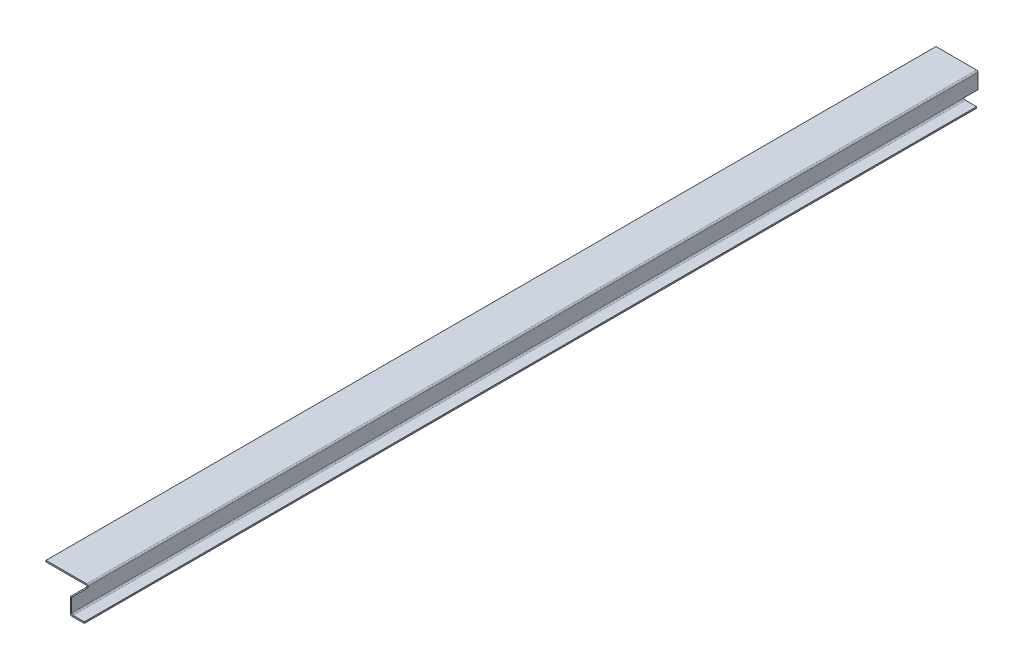
ISO-10303-21;
HEADER;
FILE_DESCRIPTION(('STEP AP214'),'2;1');
FILE_NAME('part.step','',(''),(''),'','','');
FILE_SCHEMA(('AUTOMOTIVE_DESIGN { 1 0 10303 214 1 1 1 1 }'));
ENDSEC;
DATA;
#1=APPLICATION_CONTEXT('core data for automotive mechanical design processes');
#2=APPLICATION_PROTOCOL_DEFINITION('international standard','automotive_design',2000,#1);
#3=PRODUCT_CONTEXT('',#1,'mechanical');
#4=PRODUCT('Part','Part','',(#3));
#5=PRODUCT_RELATED_PRODUCT_CATEGORY('part','',(#4));
#6=PRODUCT_DEFINITION_FORMATION('','',#4);
#7=PRODUCT_DEFINITION_CONTEXT('part definition',#1,'design');
#8=PRODUCT_DEFINITION('design','',#6,#7);
#9=PRODUCT_DEFINITION_SHAPE('','',#8);
#10=(LENGTH_UNIT() NAMED_UNIT(*) SI_UNIT(.MILLI.,.METRE.));
#11=(NAMED_UNIT(*) PLANE_ANGLE_UNIT() SI_UNIT($,.RADIAN.));
#12=(NAMED_UNIT(*) SI_UNIT($,.STERADIAN.) SOLID_ANGLE_UNIT());
#13=UNCERTAINTY_MEASURE_WITH_UNIT(LENGTH_MEASURE(1.E-05),#10,'distance_accuracy_value','');
#14=(GEOMETRIC_REPRESENTATION_CONTEXT(3) GLOBAL_UNCERTAINTY_ASSIGNED_CONTEXT((#13)) GLOBAL_UNIT_ASSIGNED_CONTEXT((#10,
#11,#12)) REPRESENTATION_CONTEXT('',''));
#15=CARTESIAN_POINT('',(0.,0.,0.));
#16=DIRECTION('',(0.,0.,1.));
#17=DIRECTION('',(1.,0.,0.));
#18=AXIS2_PLACEMENT_3D('',#15,#16,#17);
#19=CARTESIAN_POINT('',(0.,0.,0.));
#20=DIRECTION('',(0.,0.,1.));
#21=DIRECTION('',(1.,0.,0.));
#22=AXIS2_PLACEMENT_3D('',#19,#20,#21);
#23=PLANE('',#22);
#24=DIRECTION('',(1.,0.,0.));
#25=VECTOR('',#24,1.);
#26=CARTESIAN_POINT('',(87.,-32.,0.));
#27=LINE('',#26,#25);
#28=CARTESIAN_POINT('',(87.,-32.,0.));
#29=VERTEX_POINT('',#28);
#30=CARTESIAN_POINT('',(90.,-32.,0.));
#31=VERTEX_POINT('',#30);
#32=EDGE_CURVE('E146',#29,#31,#27,.T.);
#33=ORIENTED_EDGE('',*,*,#32,.F.);
#34=DIRECTION('',(0.,-1.,0.));
#35=VECTOR('',#34,1.);
#36=CARTESIAN_POINT('',(87.,0.,0.));
#37=LINE('',#36,#35);
#38=CARTESIAN_POINT('',(87.,-3.,0.));
#39=VERTEX_POINT('',#38);
#40=EDGE_CURVE('E159',#39,#29,#37,.T.);
#41=ORIENTED_EDGE('',*,*,#40,.F.);
#42=CARTESIAN_POINT('',(84.,-3.,0.));
#43=DIRECTION('',(0.,0.,1.));
#44=DIRECTION('',(1.,0.,0.));
#45=AXIS2_PLACEMENT_3D('',#42,#43,#44);
#46=CIRCLE('',#45,3.);
#47=CARTESIAN_POINT('',(84.,0.,0.));
#48=VERTEX_POINT('',#47);
#49=EDGE_CURVE('E216',#39,#48,#46,.T.);
#50=ORIENTED_EDGE('',*,*,#49,.T.);
#51=DIRECTION('',(1.,0.,0.));
#52=VECTOR('',#51,1.);
#53=CARTESIAN_POINT('',(0.,0.,0.));
#54=LINE('',#53,#52);
#55=CARTESIAN_POINT('',(0.,0.,0.));
#56=VERTEX_POINT('',#55);
#57=EDGE_CURVE('E168',#56,#48,#54,.T.);
#58=ORIENTED_EDGE('',*,*,#57,.F.);
#59=DIRECTION('',(0.,-1.,0.));
#60=VECTOR('',#59,1.);
#61=CARTESIAN_POINT('',(0.,3.,0.));
#62=LINE('',#61,#60);
#63=CARTESIAN_POINT('',(0.,3.,0.));
#64=VERTEX_POINT('',#63);
#65=EDGE_CURVE('E173',#64,#56,#62,.T.);
#66=ORIENTED_EDGE('',*,*,#65,.F.);
#67=DIRECTION('',(-1.,0.,0.));
#68=VECTOR('',#67,1.);
#69=CARTESIAN_POINT('',(0.,3.,0.));
#70=LINE('',#69,#68);
#71=CARTESIAN_POINT('',(87.,3.,0.));
#72=VERTEX_POINT('',#71);
#73=EDGE_CURVE('E170',#72,#64,#70,.T.);
#74=ORIENTED_EDGE('',*,*,#73,.F.);
#75=CARTESIAN_POINT('',(87.,0.,0.));
#76=DIRECTION('',(0.,0.,1.));
#77=DIRECTION('',(1.,0.,0.));
#78=AXIS2_PLACEMENT_3D('',#75,#76,#77);
#79=CIRCLE('',#78,3.);
#80=CARTESIAN_POINT('',(90.,0.,0.));
#81=VERTEX_POINT('',#80);
#82=EDGE_CURVE('E194',#72,#81,#79,.F.);
#83=ORIENTED_EDGE('',*,*,#82,.T.);
#84=DIRECTION('',(0.,1.,0.));
#85=VECTOR('',#84,1.);
#86=CARTESIAN_POINT('',(90.,3.,0.));
#87=LINE('',#86,#85);
#88=EDGE_CURVE('E161',#31,#81,#87,.T.);
#89=ORIENTED_EDGE('',*,*,#88,.F.);
#90=EDGE_LOOP('',(#33,#41,#50,#58,#66,#74,#83,#89));
#91=FACE_BOUND('',#90,.T.);
#92=ADVANCED_FACE('F35',(#91),#23,.F.);
#93=CARTESIAN_POINT('',(0.,3.,1940.));
#94=DIRECTION('',(1.,0.,0.));
#95=DIRECTION('',(0.,0.,-1.));
#96=AXIS2_PLACEMENT_3D('',#93,#94,#95);
#97=PLANE('',#96);
#98=DIRECTION('',(0.,0.,-1.));
#99=VECTOR('',#98,1.);
#100=CARTESIAN_POINT('',(0.,0.,1940.));
#101=LINE('',#100,#99);
#102=CARTESIAN_POINT('',(0.,0.,1905.));
#103=VERTEX_POINT('',#102);
#104=EDGE_CURVE('E189',#103,#56,#101,.T.);
#105=ORIENTED_EDGE('',*,*,#104,.F.);
#106=DIRECTION('',(0.,1.,0.));
#107=VECTOR('',#106,1.);
#108=CARTESIAN_POINT('',(0.,-3.,1905.));
#109=LINE('',#108,#107);
#110=CARTESIAN_POINT('',(0.,3.,1905.));
#111=VERTEX_POINT('',#110);
#112=EDGE_CURVE('E254',#103,#111,#109,.T.);
#113=ORIENTED_EDGE('',*,*,#112,.T.);
#114=DIRECTION('',(0.,0.,-1.));
#115=VECTOR('',#114,1.);
#116=CARTESIAN_POINT('',(0.,3.,1940.));
#117=LINE('',#116,#115);
#118=EDGE_CURVE('E180',#111,#64,#117,.T.);
#119=ORIENTED_EDGE('',*,*,#118,.T.);
#120=ORIENTED_EDGE('',*,*,#65,.T.);
#121=EDGE_LOOP('',(#105,#113,#119,#120));
#122=FACE_BOUND('',#121,.T.);
#123=ADVANCED_FACE('F306',(#122),#97,.F.);
#124=CARTESIAN_POINT('',(0.,0.,1940.));
#125=DIRECTION('',(0.,1.,0.));
#126=DIRECTION('',(0.,0.,1.));
#127=AXIS2_PLACEMENT_3D('',#124,#125,#126);
#128=PLANE('',#127);
#129=DIRECTION('',(0.,0.,-1.));
#130=VECTOR('',#129,1.);
#131=CARTESIAN_POINT('',(84.,0.,1940.));
#132=LINE('',#131,#130);
#133=CARTESIAN_POINT('',(84.,0.,1905.));
#134=VERTEX_POINT('',#133);
#135=EDGE_CURVE('E202',#48,#134,#132,.F.);
#136=ORIENTED_EDGE('',*,*,#135,.T.);
#137=DIRECTION('',(-1.,0.,0.));
#138=VECTOR('',#137,1.);
#139=CARTESIAN_POINT('',(0.,0.,1905.));
#140=LINE('',#139,#138);
#141=EDGE_CURVE('E238',#134,#103,#140,.T.);
#142=ORIENTED_EDGE('',*,*,#141,.T.);
#143=ORIENTED_EDGE('',*,*,#104,.T.);
#144=ORIENTED_EDGE('',*,*,#57,.T.);
#145=EDGE_LOOP('',(#136,#142,#143,#144));
#146=FACE_BOUND('',#145,.T.);
#147=ADVANCED_FACE('F305',(#146),#128,.F.);
#148=CARTESIAN_POINT('',(87.,0.,1940.));
#149=DIRECTION('',(1.,0.,0.));
#150=DIRECTION('',(0.,1.,0.));
#151=AXIS2_PLACEMENT_3D('',#148,#149,#150);
#152=PLANE('',#151);
#153=DIRECTION('',(0.,0.,-1.));
#154=VECTOR('',#153,1.);
#155=CARTESIAN_POINT('',(87.,-32.,30.));
#156=LINE('',#155,#154);
#157=CARTESIAN_POINT('',(87.,-32.,30.));
#158=VERTEX_POINT('',#157);
#159=EDGE_CURVE('E143',#158,#29,#156,.T.);
#160=ORIENTED_EDGE('',*,*,#159,.F.);
#161=DIRECTION('',(0.,-1.,0.));
#162=VECTOR('',#161,1.);
#163=CARTESIAN_POINT('',(87.,-32.,30.));
#164=LINE('',#163,#162);
#165=CARTESIAN_POINT('',(87.,-35.,30.));
#166=VERTEX_POINT('',#165);
#167=EDGE_CURVE('E268',#158,#166,#164,.T.);
#168=ORIENTED_EDGE('',*,*,#167,.T.);
#169=DIRECTION('',(0.,0.,-1.));
#170=VECTOR('',#169,1.);
#171=CARTESIAN_POINT('',(87.,-35.,1940.));
#172=LINE('',#171,#170);
#173=CARTESIAN_POINT('',(87.,-35.,1940.));
#174=VERTEX_POINT('',#173);
#175=EDGE_CURVE('E198',#166,#174,#172,.F.);
#176=ORIENTED_EDGE('',*,*,#175,.T.);
#177=DIRECTION('',(0.,-1.,0.));
#178=VECTOR('',#177,1.);
#179=CARTESIAN_POINT('',(87.,0.,1940.));
#180=LINE('',#179,#178);
#181=CARTESIAN_POINT('',(87.,-3.,1940.));
#182=VERTEX_POINT('',#181);
#183=EDGE_CURVE('E179',#182,#174,#180,.T.);
#184=ORIENTED_EDGE('',*,*,#183,.F.);
#185=DIRECTION('',(0.,0.,-1.));
#186=VECTOR('',#185,1.);
#187=CARTESIAN_POINT('',(87.,-3.,0.));
#188=LINE('',#187,#186);
#189=CARTESIAN_POINT('',(87.,-3.,1905.));
#190=VERTEX_POINT('',#189);
#191=EDGE_CURVE('E196',#182,#190,#188,.T.);
#192=ORIENTED_EDGE('',*,*,#191,.T.);
#193=EDGE_CURVE('E166',#190,#39,#188,.T.);
#194=ORIENTED_EDGE('',*,*,#193,.T.);
#195=ORIENTED_EDGE('',*,*,#40,.T.);
#196=EDGE_LOOP('',(#160,#168,#176,#184,#192,#194,#195));
#197=FACE_BOUND('',#196,.T.);
#198=ADVANCED_FACE('F163',(#197),#152,.F.);
#199=CARTESIAN_POINT('',(87.,-38.,1940.));
#200=DIRECTION('',(0.,1.,0.));
#201=DIRECTION('',(0.,0.,1.));
#202=AXIS2_PLACEMENT_3D('',#199,#200,#201);
#203=PLANE('',#202);
#204=DIRECTION('',(0.,0.,-1.));
#205=VECTOR('',#204,1.);
#206=CARTESIAN_POINT('',(90.,-38.,1940.));
#207=LINE('',#206,#205);
#208=CARTESIAN_POINT('',(90.,-38.,1940.));
#209=VERTEX_POINT('',#208);
#210=CARTESIAN_POINT('',(90.,-38.,30.));
#211=VERTEX_POINT('',#210);
#212=EDGE_CURVE('E191',#209,#211,#207,.T.);
#213=ORIENTED_EDGE('',*,*,#212,.T.);
#214=DIRECTION('',(-1.,0.,0.));
#215=VECTOR('',#214,1.);
#216=CARTESIAN_POINT('',(117.,-38.,30.));
#217=LINE('',#216,#215);
#218=CARTESIAN_POINT('',(117.,-38.,30.));
#219=VERTEX_POINT('',#218);
#220=EDGE_CURVE('E154',#219,#211,#217,.T.);
#221=ORIENTED_EDGE('',*,*,#220,.F.);
#222=DIRECTION('',(0.,0.,-1.));
#223=VECTOR('',#222,1.);
#224=CARTESIAN_POINT('',(117.,-38.,1940.));
#225=LINE('',#224,#223);
#226=CARTESIAN_POINT('',(117.,-38.,1940.));
#227=VERTEX_POINT('',#226);
#228=EDGE_CURVE('E186',#227,#219,#225,.T.);
#229=ORIENTED_EDGE('',*,*,#228,.F.);
#230=DIRECTION('',(1.,0.,0.));
#231=VECTOR('',#230,1.);
#232=CARTESIAN_POINT('',(87.,-38.,1940.));
#233=LINE('',#232,#231);
#234=EDGE_CURVE('E248',#209,#227,#233,.T.);
#235=ORIENTED_EDGE('',*,*,#234,.F.);
#236=EDGE_LOOP('',(#213,#221,#229,#235));
#237=FACE_BOUND('',#236,.T.);
#238=ADVANCED_FACE('F286',(#237),#203,.F.);
#239=CARTESIAN_POINT('',(117.,-35.,1940.));
#240=DIRECTION('',(-1.,0.,0.));
#241=DIRECTION('',(0.,0.,1.));
#242=AXIS2_PLACEMENT_3D('',#239,#240,#241);
#243=PLANE('',#242);
#244=ORIENTED_EDGE('',*,*,#228,.T.);
#245=DIRECTION('',(0.,-1.,0.));
#246=VECTOR('',#245,1.);
#247=CARTESIAN_POINT('',(117.,-32.,30.));
#248=LINE('',#247,#246);
#249=CARTESIAN_POINT('',(117.,-35.,30.));
#250=VERTEX_POINT('',#249);
#251=EDGE_CURVE('E269',#250,#219,#248,.T.);
#252=ORIENTED_EDGE('',*,*,#251,.F.);
#253=DIRECTION('',(0.,0.,-1.));
#254=VECTOR('',#253,1.);
#255=CARTESIAN_POINT('',(117.,-35.,1940.));
#256=LINE('',#255,#254);
#257=CARTESIAN_POINT('',(117.,-35.,1940.));
#258=VERTEX_POINT('',#257);
#259=EDGE_CURVE('E182',#258,#250,#256,.T.);
#260=ORIENTED_EDGE('',*,*,#259,.F.);
#261=DIRECTION('',(0.,1.,0.));
#262=VECTOR('',#261,1.);
#263=CARTESIAN_POINT('',(117.,-35.,1940.));
#264=LINE('',#263,#262);
#265=EDGE_CURVE('E246',#227,#258,#264,.T.);
#266=ORIENTED_EDGE('',*,*,#265,.F.);
#267=EDGE_LOOP('',(#244,#252,#260,#266));
#268=FACE_BOUND('',#267,.T.);
#269=ADVANCED_FACE('F344',(#268),#243,.F.);
#270=CARTESIAN_POINT('',(90.,-35.,1940.));
#271=DIRECTION('',(0.,-1.,0.));
#272=DIRECTION('',(0.,0.,-1.));
#273=AXIS2_PLACEMENT_3D('',#270,#271,#272);
#274=PLANE('',#273);
#275=ORIENTED_EDGE('',*,*,#259,.T.);
#276=DIRECTION('',(-1.,0.,0.));
#277=VECTOR('',#276,1.);
#278=CARTESIAN_POINT('',(90.0000000000002,-35.,30.));
#279=LINE('',#278,#277);
#280=CARTESIAN_POINT('',(93.,-35.,30.));
#281=VERTEX_POINT('',#280);
#282=EDGE_CURVE('E265',#250,#281,#279,.T.);
#283=ORIENTED_EDGE('',*,*,#282,.T.);
#284=DIRECTION('',(0.,0.,-1.));
#285=VECTOR('',#284,1.);
#286=CARTESIAN_POINT('',(93.,-35.,1940.));
#287=LINE('',#286,#285);
#288=CARTESIAN_POINT('',(93.,-35.,1940.));
#289=VERTEX_POINT('',#288);
#290=EDGE_CURVE('E212',#281,#289,#287,.F.);
#291=ORIENTED_EDGE('',*,*,#290,.T.);
#292=DIRECTION('',(-1.,0.,0.));
#293=VECTOR('',#292,1.);
#294=CARTESIAN_POINT('',(90.,-35.,1940.));
#295=LINE('',#294,#293);
#296=EDGE_CURVE('E244',#258,#289,#295,.T.);
#297=ORIENTED_EDGE('',*,*,#296,.F.);
#298=EDGE_LOOP('',(#275,#283,#291,#297));
#299=FACE_BOUND('',#298,.T.);
#300=ADVANCED_FACE('F341',(#299),#274,.F.);
#301=CARTESIAN_POINT('',(90.,3.,1940.));
#302=DIRECTION('',(-1.,0.,0.));
#303=DIRECTION('',(0.,0.,1.));
#304=AXIS2_PLACEMENT_3D('',#301,#302,#303);
#305=PLANE('',#304);
#306=DIRECTION('',(0.,0.,-1.));
#307=VECTOR('',#306,1.);
#308=CARTESIAN_POINT('',(90.,0.,1940.));
#309=LINE('',#308,#307);
#310=CARTESIAN_POINT('',(90.,0.,1905.));
#311=VERTEX_POINT('',#310);
#312=EDGE_CURVE('E205',#81,#311,#309,.F.);
#313=ORIENTED_EDGE('',*,*,#312,.T.);
#314=DIRECTION('',(0.,1.,0.));
#315=VECTOR('',#314,1.);
#316=CARTESIAN_POINT('',(90.,-3.,1905.));
#317=LINE('',#316,#315);
#318=CARTESIAN_POINT('',(90.,-3.,1905.));
#319=VERTEX_POINT('',#318);
#320=EDGE_CURVE('E50',#319,#311,#317,.T.);
#321=ORIENTED_EDGE('',*,*,#320,.F.);
#322=DIRECTION('',(0.,0.,-1.));
#323=VECTOR('',#322,1.);
#324=CARTESIAN_POINT('',(90.,-3.,1905.));
#325=LINE('',#324,#323);
#326=CARTESIAN_POINT('',(90.,-3.,1940.));
#327=VERTEX_POINT('',#326);
#328=EDGE_CURVE('E260',#327,#319,#325,.T.);
#329=ORIENTED_EDGE('',*,*,#328,.F.);
#330=DIRECTION('',(0.,1.,0.));
#331=VECTOR('',#330,1.);
#332=CARTESIAN_POINT('',(90.,3.,1940.));
#333=LINE('',#332,#331);
#334=CARTESIAN_POINT('',(90.,-32.,1940.));
#335=VERTEX_POINT('',#334);
#336=EDGE_CURVE('E183',#335,#327,#333,.T.);
#337=ORIENTED_EDGE('',*,*,#336,.F.);
#338=DIRECTION('',(0.,0.,-1.));
#339=VECTOR('',#338,1.);
#340=CARTESIAN_POINT('',(90.,-32.,0.));
#341=LINE('',#340,#339);
#342=CARTESIAN_POINT('',(90.,-32.,30.));
#343=VERTEX_POINT('',#342);
#344=EDGE_CURVE('E209',#335,#343,#341,.T.);
#345=ORIENTED_EDGE('',*,*,#344,.T.);
#346=EDGE_CURVE('E208',#343,#31,#341,.T.);
#347=ORIENTED_EDGE('',*,*,#346,.T.);
#348=ORIENTED_EDGE('',*,*,#88,.T.);
#349=EDGE_LOOP('',(#313,#321,#329,#337,#345,#347,#348));
#350=FACE_BOUND('',#349,.T.);
#351=ADVANCED_FACE('F297',(#350),#305,.F.);
#352=CARTESIAN_POINT('',(0.,3.,1940.));
#353=DIRECTION('',(0.,-1.,0.));
#354=DIRECTION('',(0.,0.,-1.));
#355=AXIS2_PLACEMENT_3D('',#352,#353,#354);
#356=PLANE('',#355);
#357=ORIENTED_EDGE('',*,*,#118,.F.);
#358=DIRECTION('',(-1.,0.,0.));
#359=VECTOR('',#358,1.);
#360=CARTESIAN_POINT('',(0.,3.,1905.));
#361=LINE('',#360,#359);
#362=CARTESIAN_POINT('',(87.,3.,1905.));
#363=VERTEX_POINT('',#362);
#364=EDGE_CURVE('E220',#363,#111,#361,.T.);
#365=ORIENTED_EDGE('',*,*,#364,.F.);
#366=DIRECTION('',(0.,0.,-1.));
#367=VECTOR('',#366,1.);
#368=CARTESIAN_POINT('',(87.,3.,1940.));
#369=LINE('',#368,#367);
#370=EDGE_CURVE('E214',#363,#72,#369,.T.);
#371=ORIENTED_EDGE('',*,*,#370,.T.);
#372=ORIENTED_EDGE('',*,*,#73,.T.);
#373=EDGE_LOOP('',(#357,#365,#371,#372));
#374=FACE_BOUND('',#373,.T.);
#375=ADVANCED_FACE('F227',(#374),#356,.F.);
#376=CARTESIAN_POINT('',(0.,0.,1940.));
#377=DIRECTION('',(0.,0.,1.));
#378=DIRECTION('',(1.,0.,0.));
#379=AXIS2_PLACEMENT_3D('',#376,#377,#378);
#380=PLANE('',#379);
#381=DIRECTION('',(1.,0.,0.));
#382=VECTOR('',#381,1.);
#383=CARTESIAN_POINT('',(90.,-3.,1940.));
#384=LINE('',#383,#382);
#385=EDGE_CURVE('E229',#182,#327,#384,.T.);
#386=ORIENTED_EDGE('',*,*,#385,.F.);
#387=ORIENTED_EDGE('',*,*,#183,.T.);
#388=CARTESIAN_POINT('',(90.,-35.,1940.));
#389=DIRECTION('',(0.,0.,1.));
#390=DIRECTION('',(1.,0.,0.));
#391=AXIS2_PLACEMENT_3D('',#388,#389,#390);
#392=CIRCLE('',#391,3.);
#393=EDGE_CURVE('E200',#174,#209,#392,.T.);
#394=ORIENTED_EDGE('',*,*,#393,.T.);
#395=ORIENTED_EDGE('',*,*,#234,.T.);
#396=ORIENTED_EDGE('',*,*,#265,.T.);
#397=ORIENTED_EDGE('',*,*,#296,.T.);
#398=CARTESIAN_POINT('',(93.,-32.,1940.));
#399=DIRECTION('',(0.,0.,1.));
#400=DIRECTION('',(1.,0.,0.));
#401=AXIS2_PLACEMENT_3D('',#398,#399,#400);
#402=CIRCLE('',#401,3.);
#403=EDGE_CURVE('E58',#289,#335,#402,.F.);
#404=ORIENTED_EDGE('',*,*,#403,.T.);
#405=ORIENTED_EDGE('',*,*,#336,.T.);
#406=EDGE_LOOP('',(#386,#387,#394,#395,#396,#397,#404,#405));
#407=FACE_BOUND('',#406,.T.);
#408=ADVANCED_FACE('F289',(#407),#380,.T.);
#409=CARTESIAN_POINT('',(90.,-35.,1940.));
#410=DIRECTION('',(0.,0.,-1.));
#411=DIRECTION('',(-1.,0.,0.));
#412=AXIS2_PLACEMENT_3D('',#409,#410,#411);
#413=CYLINDRICAL_SURFACE('',#412,3.);
#414=CARTESIAN_POINT('',(90.,-35.,30.));
#415=DIRECTION('',(0.,0.,1.));
#416=DIRECTION('',(1.,0.,0.));
#417=AXIS2_PLACEMENT_3D('',#414,#415,#416);
#418=CIRCLE('',#417,3.);
#419=EDGE_CURVE('E230',#211,#166,#418,.F.);
#420=ORIENTED_EDGE('',*,*,#419,.F.);
#421=ORIENTED_EDGE('',*,*,#212,.F.);
#422=ORIENTED_EDGE('',*,*,#393,.F.);
#423=ORIENTED_EDGE('',*,*,#175,.F.);
#424=EDGE_LOOP('',(#420,#421,#422,#423));
#425=FACE_BOUND('',#424,.T.);
#426=ADVANCED_FACE('F283',(#425),#413,.T.);
#427=CARTESIAN_POINT('',(84.,-3.,1940.));
#428=DIRECTION('',(0.,0.,1.));
#429=DIRECTION('',(1.,0.,0.));
#430=AXIS2_PLACEMENT_3D('',#427,#428,#429);
#431=CYLINDRICAL_SURFACE('',#430,3.);
#432=ORIENTED_EDGE('',*,*,#193,.F.);
#433=CARTESIAN_POINT('',(84.,-3.,1905.));
#434=DIRECTION('',(0.,0.,-1.));
#435=DIRECTION('',(-1.,0.,0.));
#436=AXIS2_PLACEMENT_3D('',#433,#434,#435);
#437=CIRCLE('',#436,3.);
#438=EDGE_CURVE('E240',#190,#134,#437,.F.);
#439=ORIENTED_EDGE('',*,*,#438,.T.);
#440=ORIENTED_EDGE('',*,*,#135,.F.);
#441=ORIENTED_EDGE('',*,*,#49,.F.);
#442=EDGE_LOOP('',(#432,#439,#440,#441));
#443=FACE_BOUND('',#442,.T.);
#444=ADVANCED_FACE('F302',(#443),#431,.F.);
#445=CARTESIAN_POINT('',(93.,-32.,1940.));
#446=DIRECTION('',(0.,0.,1.));
#447=DIRECTION('',(1.,0.,0.));
#448=AXIS2_PLACEMENT_3D('',#445,#446,#447);
#449=CYLINDRICAL_SURFACE('',#448,3.);
#450=ORIENTED_EDGE('',*,*,#290,.F.);
#451=CARTESIAN_POINT('',(93.,-32.,30.));
#452=DIRECTION('',(0.,0.,1.));
#453=DIRECTION('',(1.,0.,0.));
#454=AXIS2_PLACEMENT_3D('',#451,#452,#453);
#455=CIRCLE('',#454,3.);
#456=EDGE_CURVE('E11',#281,#343,#455,.F.);
#457=ORIENTED_EDGE('',*,*,#456,.T.);
#458=ORIENTED_EDGE('',*,*,#344,.F.);
#459=ORIENTED_EDGE('',*,*,#403,.F.);
#460=EDGE_LOOP('',(#450,#457,#458,#459));
#461=FACE_BOUND('',#460,.T.);
#462=ADVANCED_FACE('F295',(#461),#449,.F.);
#463=CARTESIAN_POINT('',(87.,0.,1940.));
#464=DIRECTION('',(0.,0.,-1.));
#465=DIRECTION('',(-1.,0.,0.));
#466=AXIS2_PLACEMENT_3D('',#463,#464,#465);
#467=CYLINDRICAL_SURFACE('',#466,3.);
#468=CARTESIAN_POINT('',(87.,0.,1905.));
#469=DIRECTION('',(0.,0.,-1.));
#470=DIRECTION('',(-1.,0.,0.));
#471=AXIS2_PLACEMENT_3D('',#468,#469,#470);
#472=CIRCLE('',#471,3.);
#473=EDGE_CURVE('E43',#311,#363,#472,.F.);
#474=ORIENTED_EDGE('',*,*,#473,.F.);
#475=ORIENTED_EDGE('',*,*,#312,.F.);
#476=ORIENTED_EDGE('',*,*,#82,.F.);
#477=ORIENTED_EDGE('',*,*,#370,.F.);
#478=EDGE_LOOP('',(#474,#475,#476,#477));
#479=FACE_BOUND('',#478,.T.);
#480=ADVANCED_FACE('F37',(#479),#467,.T.);
#481=CARTESIAN_POINT('',(0.,-3.,0.));
#482=DIRECTION('',(0.,-1.,0.));
#483=DIRECTION('',(0.,0.,-1.));
#484=AXIS2_PLACEMENT_3D('',#481,#482,#483);
#485=PLANE('',#484);
#486=ORIENTED_EDGE('',*,*,#385,.T.);
#487=ORIENTED_EDGE('',*,*,#328,.T.);
#488=DIRECTION('',(-1.,0.,0.));
#489=VECTOR('',#488,1.);
#490=CARTESIAN_POINT('',(0.,-3.,1905.));
#491=LINE('',#490,#489);
#492=EDGE_CURVE('E256',#319,#190,#491,.T.);
#493=ORIENTED_EDGE('',*,*,#492,.T.);
#494=ORIENTED_EDGE('',*,*,#191,.F.);
#495=EDGE_LOOP('',(#486,#487,#493,#494));
#496=FACE_BOUND('',#495,.T.);
#497=ADVANCED_FACE('F300',(#496),#485,.F.);
#498=CARTESIAN_POINT('',(0.,-3.,1905.));
#499=DIRECTION('',(0.,0.,-1.));
#500=DIRECTION('',(-1.,0.,0.));
#501=AXIS2_PLACEMENT_3D('',#498,#499,#500);
#502=PLANE('',#501);
#503=ORIENTED_EDGE('',*,*,#438,.F.);
#504=ORIENTED_EDGE('',*,*,#492,.F.);
#505=ORIENTED_EDGE('',*,*,#320,.T.);
#506=ORIENTED_EDGE('',*,*,#473,.T.);
#507=ORIENTED_EDGE('',*,*,#364,.T.);
#508=ORIENTED_EDGE('',*,*,#112,.F.);
#509=ORIENTED_EDGE('',*,*,#141,.F.);
#510=EDGE_LOOP('',(#503,#504,#505,#506,#507,#508,#509));
#511=FACE_BOUND('',#510,.T.);
#512=ADVANCED_FACE('F219',(#511),#502,.F.);
#513=CARTESIAN_POINT('',(117.,-32.,30.));
#514=DIRECTION('',(0.,0.,1.));
#515=DIRECTION('',(1.,0.,0.));
#516=AXIS2_PLACEMENT_3D('',#513,#514,#515);
#517=PLANE('',#516);
#518=ORIENTED_EDGE('',*,*,#419,.T.);
#519=ORIENTED_EDGE('',*,*,#167,.F.);
#520=DIRECTION('',(-1.,0.,0.));
#521=VECTOR('',#520,1.);
#522=CARTESIAN_POINT('',(117.,-32.,30.));
#523=LINE('',#522,#521);
#524=EDGE_CURVE('E149',#343,#158,#523,.T.);
#525=ORIENTED_EDGE('',*,*,#524,.F.);
#526=ORIENTED_EDGE('',*,*,#456,.F.);
#527=ORIENTED_EDGE('',*,*,#282,.F.);
#528=ORIENTED_EDGE('',*,*,#251,.T.);
#529=ORIENTED_EDGE('',*,*,#220,.T.);
#530=EDGE_LOOP('',(#518,#519,#525,#526,#527,#528,#529));
#531=FACE_BOUND('',#530,.T.);
#532=ADVANCED_FACE('F276',(#531),#517,.F.);
#533=CARTESIAN_POINT('',(0.,-32.,0.));
#534=DIRECTION('',(0.,-1.,0.));
#535=DIRECTION('',(0.,0.,-1.));
#536=AXIS2_PLACEMENT_3D('',#533,#534,#535);
#537=PLANE('',#536);
#538=ORIENTED_EDGE('',*,*,#346,.F.);
#539=ORIENTED_EDGE('',*,*,#524,.T.);
#540=ORIENTED_EDGE('',*,*,#159,.T.);
#541=ORIENTED_EDGE('',*,*,#32,.T.);
#542=EDGE_LOOP('',(#538,#539,#540,#541));
#543=FACE_BOUND('',#542,.T.);
#544=ADVANCED_FACE('F145',(#543),#537,.T.);
#545=CLOSED_SHELL('',(#92,#123,#147,#198,#238,#269,#300,#351,#375,#408,#426,#444,#462,#480,#497,
#512,#532,#544));
#546=MANIFOLD_SOLID_BREP('B2',#545);
#547=ADVANCED_BREP_SHAPE_REPRESENTATION('',(#18,#546),#14);
#548=SHAPE_DEFINITION_REPRESENTATION(#9,#547);
ENDSEC;
END-ISO-10303-21;
